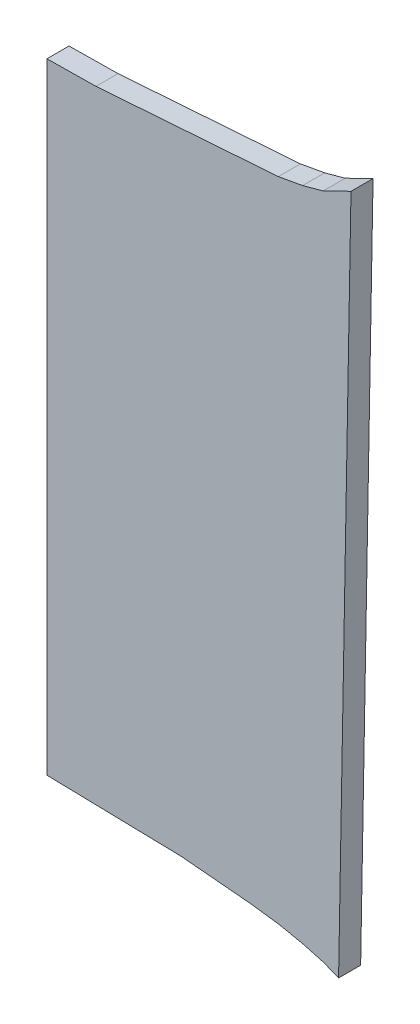
ISO-10303-21;
HEADER;
FILE_DESCRIPTION(('STEP AP214'),'2;1');
FILE_NAME('part.step','',(''),(''),'','','');
FILE_SCHEMA(('AUTOMOTIVE_DESIGN { 1 0 10303 214 1 1 1 1 }'));
ENDSEC;
DATA;
#1=APPLICATION_CONTEXT('core data for automotive mechanical design processes');
#2=APPLICATION_PROTOCOL_DEFINITION('international standard','automotive_design',2000,#1);
#3=PRODUCT_CONTEXT('',#1,'mechanical');
#4=PRODUCT('Part','Part','',(#3));
#5=PRODUCT_RELATED_PRODUCT_CATEGORY('part','',(#4));
#6=PRODUCT_DEFINITION_FORMATION('','',#4);
#7=PRODUCT_DEFINITION_CONTEXT('part definition',#1,'design');
#8=PRODUCT_DEFINITION('design','',#6,#7);
#9=PRODUCT_DEFINITION_SHAPE('','',#8);
#10=(LENGTH_UNIT() NAMED_UNIT(*) SI_UNIT(.MILLI.,.METRE.));
#11=(NAMED_UNIT(*) PLANE_ANGLE_UNIT() SI_UNIT($,.RADIAN.));
#12=(NAMED_UNIT(*) SI_UNIT($,.STERADIAN.) SOLID_ANGLE_UNIT());
#13=UNCERTAINTY_MEASURE_WITH_UNIT(LENGTH_MEASURE(1.E-05),#10,'distance_accuracy_value','');
#14=(GEOMETRIC_REPRESENTATION_CONTEXT(3) GLOBAL_UNCERTAINTY_ASSIGNED_CONTEXT((#13)) GLOBAL_UNIT_ASSIGNED_CONTEXT((#10,
#11,#12)) REPRESENTATION_CONTEXT('',''));
#15=CARTESIAN_POINT('',(0.,0.,0.));
#16=DIRECTION('',(0.,0.,1.));
#17=DIRECTION('',(1.,0.,0.));
#18=AXIS2_PLACEMENT_3D('',#15,#16,#17);
#19=CARTESIAN_POINT('',(79.9499969482422,95.5,0.));
#20=DIRECTION('',(0.0231288775813622,0.999732491730576,0.));
#21=DIRECTION('',(0.999732491730576,-0.0231288775813622,0.));
#22=AXIS2_PLACEMENT_3D('',#19,#20,#21);
#23=PLANE('',#22);
#24=DIRECTION('',(0.999732491730576,-0.0231288775813622,0.));
#25=VECTOR('',#24,1.);
#26=CARTESIAN_POINT('',(79.9499969482422,95.5,0.03556));
#27=LINE('',#26,#25);
#28=CARTESIAN_POINT('',(79.9499969482422,95.5,0.03556));
#29=VERTEX_POINT('',#28);
#30=CARTESIAN_POINT('',(80.1660003662109,95.495002746582,0.03556));
#31=VERTEX_POINT('',#30);
#32=EDGE_CURVE('E11',#29,#31,#27,.T.);
#33=ORIENTED_EDGE('',*,*,#32,.F.);
#34=DIRECTION('',(0.,0.,1.));
#35=VECTOR('',#34,1.);
#36=CARTESIAN_POINT('',(79.9499969482422,95.5,0.));
#37=LINE('',#36,#35);
#38=CARTESIAN_POINT('',(79.9499969482422,95.5,0.));
#39=VERTEX_POINT('',#38);
#40=EDGE_CURVE('E24',#39,#29,#37,.T.);
#41=ORIENTED_EDGE('',*,*,#40,.F.);
#42=DIRECTION('',(0.999732491730576,-0.0231288775813622,0.));
#43=VECTOR('',#42,1.);
#44=CARTESIAN_POINT('',(79.9499969482422,95.5,0.));
#45=LINE('',#44,#43);
#46=CARTESIAN_POINT('',(80.1660003662109,95.495002746582,0.));
#47=VERTEX_POINT('',#46);
#48=EDGE_CURVE('E130',#39,#47,#45,.T.);
#49=ORIENTED_EDGE('',*,*,#48,.T.);
#50=DIRECTION('',(0.,0.,1.));
#51=VECTOR('',#50,1.);
#52=CARTESIAN_POINT('',(80.1660003662109,95.495002746582,0.));
#53=LINE('',#52,#51);
#54=EDGE_CURVE('E37',#47,#31,#53,.T.);
#55=ORIENTED_EDGE('',*,*,#54,.T.);
#56=EDGE_LOOP('',(#33,#41,#49,#55));
#57=FACE_BOUND('',#56,.T.);
#58=ADVANCED_FACE('F17',(#57),#23,.F.);
#59=CARTESIAN_POINT('',(80.1660003662109,95.495002746582,0.));
#60=DIRECTION('',(0.0897456692717737,0.995964715663643,0.));
#61=DIRECTION('',(0.995964715663643,-0.0897456692717737,0.));
#62=AXIS2_PLACEMENT_3D('',#59,#60,#61);
#63=PLANE('',#62);
#64=DIRECTION('',(0.995964715663643,-0.0897456692717737,0.));
#65=VECTOR('',#64,1.);
#66=CARTESIAN_POINT('',(80.1660003662109,95.495002746582,0.03556));
#67=LINE('',#66,#65);
#68=CARTESIAN_POINT('',(80.2770004272461,95.4850006103516,0.03556));
#69=VERTEX_POINT('',#68);
#70=EDGE_CURVE('E210',#31,#69,#67,.T.);
#71=ORIENTED_EDGE('',*,*,#70,.F.);
#72=ORIENTED_EDGE('',*,*,#54,.F.);
#73=DIRECTION('',(0.995964715663643,-0.0897456692717737,0.));
#74=VECTOR('',#73,1.);
#75=CARTESIAN_POINT('',(80.1660003662109,95.495002746582,0.));
#76=LINE('',#75,#74);
#77=CARTESIAN_POINT('',(80.2770004272461,95.4850006103516,0.));
#78=VERTEX_POINT('',#77);
#79=EDGE_CURVE('E207',#47,#78,#76,.T.);
#80=ORIENTED_EDGE('',*,*,#79,.T.);
#81=DIRECTION('',(0.,0.,1.));
#82=VECTOR('',#81,1.);
#83=CARTESIAN_POINT('',(80.2770004272461,95.4850006103516,0.));
#84=LINE('',#83,#82);
#85=EDGE_CURVE('E205',#78,#69,#84,.T.);
#86=ORIENTED_EDGE('',*,*,#85,.T.);
#87=EDGE_LOOP('',(#71,#72,#80,#86));
#88=FACE_BOUND('',#87,.T.);
#89=ADVANCED_FACE('F218',(#88),#63,.F.);
#90=CARTESIAN_POINT('',(80.2770004272461,95.4850006103516,0.));
#91=DIRECTION('',(0.129437620660577,0.991587566661527,0.));
#92=DIRECTION('',(0.991587566661527,-0.129437620660577,0.));
#93=AXIS2_PLACEMENT_3D('',#90,#91,#92);
#94=PLANE('',#93);
#95=DIRECTION('',(0.991587566661527,-0.129437620660577,0.));
#96=VECTOR('',#95,1.);
#97=CARTESIAN_POINT('',(80.2770004272461,95.4850006103516,0.03556));
#98=LINE('',#97,#96);
#99=CARTESIAN_POINT('',(80.322998046875,95.4789962768555,0.03556));
#100=VERTEX_POINT('',#99);
#101=EDGE_CURVE('E202',#69,#100,#98,.T.);
#102=ORIENTED_EDGE('',*,*,#101,.F.);
#103=ORIENTED_EDGE('',*,*,#85,.F.);
#104=DIRECTION('',(0.991587566661527,-0.129437620660577,0.));
#105=VECTOR('',#104,1.);
#106=CARTESIAN_POINT('',(80.2770004272461,95.4850006103516,0.));
#107=LINE('',#106,#105);
#108=CARTESIAN_POINT('',(80.322998046875,95.4789962768555,0.));
#109=VERTEX_POINT('',#108);
#110=EDGE_CURVE('E199',#78,#109,#107,.T.);
#111=ORIENTED_EDGE('',*,*,#110,.T.);
#112=DIRECTION('',(0.,0.,1.));
#113=VECTOR('',#112,1.);
#114=CARTESIAN_POINT('',(80.322998046875,95.4789962768555,0.));
#115=LINE('',#114,#113);
#116=EDGE_CURVE('E197',#109,#100,#115,.T.);
#117=ORIENTED_EDGE('',*,*,#116,.T.);
#118=EDGE_LOOP('',(#102,#103,#111,#117));
#119=FACE_BOUND('',#118,.T.);
#120=ADVANCED_FACE('F224',(#119),#94,.F.);
#121=CARTESIAN_POINT('',(80.322998046875,95.4789962768555,0.));
#122=DIRECTION('',(0.200830976371698,0.979625907645153,0.));
#123=DIRECTION('',(0.979625907645153,-0.200830976371698,0.));
#124=AXIS2_PLACEMENT_3D('',#121,#122,#123);
#125=PLANE('',#124);
#126=DIRECTION('',(0.979625907645153,-0.200830976371698,0.));
#127=VECTOR('',#126,1.);
#128=CARTESIAN_POINT('',(80.322998046875,95.4789962768555,0.03556));
#129=LINE('',#128,#127);
#130=CARTESIAN_POINT('',(80.3619995117188,95.4710006713867,0.03556));
#131=VERTEX_POINT('',#130);
#132=EDGE_CURVE('E194',#100,#131,#129,.T.);
#133=ORIENTED_EDGE('',*,*,#132,.F.);
#134=ORIENTED_EDGE('',*,*,#116,.F.);
#135=DIRECTION('',(0.979625907645153,-0.200830976371698,0.));
#136=VECTOR('',#135,1.);
#137=CARTESIAN_POINT('',(80.322998046875,95.4789962768555,0.));
#138=LINE('',#137,#136);
#139=CARTESIAN_POINT('',(80.3619995117188,95.4710006713867,0.));
#140=VERTEX_POINT('',#139);
#141=EDGE_CURVE('E191',#109,#140,#138,.T.);
#142=ORIENTED_EDGE('',*,*,#141,.T.);
#143=DIRECTION('',(0.,0.,1.));
#144=VECTOR('',#143,1.);
#145=CARTESIAN_POINT('',(80.3619995117188,95.4710006713867,0.));
#146=LINE('',#145,#144);
#147=EDGE_CURVE('E189',#140,#131,#146,.T.);
#148=ORIENTED_EDGE('',*,*,#147,.T.);
#149=EDGE_LOOP('',(#133,#134,#142,#148));
#150=FACE_BOUND('',#149,.T.);
#151=ADVANCED_FACE('F226',(#150),#125,.F.);
#152=CARTESIAN_POINT('',(80.3619995117188,95.4710006713867,0.));
#153=DIRECTION('',(0.263211776421839,0.964738078834281,0.));
#154=DIRECTION('',(0.964738078834281,-0.263211776421839,0.));
#155=AXIS2_PLACEMENT_3D('',#152,#153,#154);
#156=PLANE('',#155);
#157=DIRECTION('',(0.964738078834281,-0.263211776421839,0.));
#158=VECTOR('',#157,1.);
#159=CARTESIAN_POINT('',(80.3619995117188,95.4710006713867,0.03556));
#160=LINE('',#159,#158);
#161=CARTESIAN_POINT('',(80.3949966430664,95.4619979858398,0.03556));
#162=VERTEX_POINT('',#161);
#163=EDGE_CURVE('E186',#131,#162,#160,.T.);
#164=ORIENTED_EDGE('',*,*,#163,.F.);
#165=ORIENTED_EDGE('',*,*,#147,.F.);
#166=DIRECTION('',(0.964738078834281,-0.263211776421839,0.));
#167=VECTOR('',#166,1.);
#168=CARTESIAN_POINT('',(80.3619995117188,95.4710006713867,0.));
#169=LINE('',#168,#167);
#170=CARTESIAN_POINT('',(80.3949966430664,95.4619979858398,0.));
#171=VERTEX_POINT('',#170);
#172=EDGE_CURVE('E183',#140,#171,#169,.T.);
#173=ORIENTED_EDGE('',*,*,#172,.T.);
#174=DIRECTION('',(0.,0.,1.));
#175=VECTOR('',#174,1.);
#176=CARTESIAN_POINT('',(80.3949966430664,95.4619979858398,0.));
#177=LINE('',#176,#175);
#178=EDGE_CURVE('E181',#171,#162,#177,.T.);
#179=ORIENTED_EDGE('',*,*,#178,.T.);
#180=EDGE_LOOP('',(#164,#165,#173,#179));
#181=FACE_BOUND('',#180,.T.);
#182=ADVANCED_FACE('F231',(#181),#156,.F.);
#183=CARTESIAN_POINT('',(80.3949966430664,95.4619979858398,0.));
#184=DIRECTION('',(0.371195250781088,0.928554837259257,0.));
#185=DIRECTION('',(0.928554837259257,-0.371195250781088,0.));
#186=AXIS2_PLACEMENT_3D('',#183,#184,#185);
#187=PLANE('',#186);
#188=DIRECTION('',(0.928554837259257,-0.371195250781088,0.));
#189=VECTOR('',#188,1.);
#190=CARTESIAN_POINT('',(80.3949966430664,95.4619979858398,0.03556));
#191=LINE('',#190,#189);
#192=CARTESIAN_POINT('',(80.4199981689453,95.4520034790039,0.03556));
#193=VERTEX_POINT('',#192);
#194=EDGE_CURVE('E178',#162,#193,#191,.T.);
#195=ORIENTED_EDGE('',*,*,#194,.F.);
#196=ORIENTED_EDGE('',*,*,#178,.F.);
#197=DIRECTION('',(0.928554837259257,-0.371195250781088,0.));
#198=VECTOR('',#197,1.);
#199=CARTESIAN_POINT('',(80.3949966430664,95.4619979858398,0.));
#200=LINE('',#199,#198);
#201=CARTESIAN_POINT('',(80.4199981689453,95.4520034790039,0.));
#202=VERTEX_POINT('',#201);
#203=EDGE_CURVE('E175',#171,#202,#200,.T.);
#204=ORIENTED_EDGE('',*,*,#203,.T.);
#205=DIRECTION('',(0.,0.,1.));
#206=VECTOR('',#205,1.);
#207=CARTESIAN_POINT('',(80.4199981689453,95.4520034790039,0.));
#208=LINE('',#207,#206);
#209=EDGE_CURVE('E173',#202,#193,#208,.T.);
#210=ORIENTED_EDGE('',*,*,#209,.T.);
#211=EDGE_LOOP('',(#195,#196,#204,#210));
#212=FACE_BOUND('',#211,.T.);
#213=ADVANCED_FACE('F234',(#212),#187,.F.);
#214=CARTESIAN_POINT('',(80.4199981689453,95.4520034790039,0.));
#215=DIRECTION('',(-0.999837057457282,0.0180515521538901,0.));
#216=DIRECTION('',(0.0180515521538901,0.999837057457282,0.));
#217=AXIS2_PLACEMENT_3D('',#214,#215,#216);
#218=PLANE('',#217);
#219=DIRECTION('',(0.0180515521538901,0.999837057457282,0.));
#220=VECTOR('',#219,1.);
#221=CARTESIAN_POINT('',(80.4199981689453,95.4520034790039,0.03556));
#222=LINE('',#221,#220);
#223=CARTESIAN_POINT('',(80.4400024414062,96.5599975585938,0.03556));
#224=VERTEX_POINT('',#223);
#225=EDGE_CURVE('E170',#193,#224,#222,.T.);
#226=ORIENTED_EDGE('',*,*,#225,.F.);
#227=ORIENTED_EDGE('',*,*,#209,.F.);
#228=DIRECTION('',(0.0180515521538901,0.999837057457282,0.));
#229=VECTOR('',#228,1.);
#230=CARTESIAN_POINT('',(80.4199981689453,95.4520034790039,0.));
#231=LINE('',#230,#229);
#232=CARTESIAN_POINT('',(80.4400024414062,96.5599975585938,0.));
#233=VERTEX_POINT('',#232);
#234=EDGE_CURVE('E167',#202,#233,#231,.T.);
#235=ORIENTED_EDGE('',*,*,#234,.T.);
#236=DIRECTION('',(0.,0.,1.));
#237=VECTOR('',#236,1.);
#238=CARTESIAN_POINT('',(80.4400024414062,96.5599975585938,0.));
#239=LINE('',#238,#237);
#240=EDGE_CURVE('E165',#233,#224,#239,.T.);
#241=ORIENTED_EDGE('',*,*,#240,.T.);
#242=EDGE_LOOP('',(#226,#227,#235,#241));
#243=FACE_BOUND('',#242,.T.);
#244=ADVANCED_FACE('F239',(#243),#218,.F.);
#245=CARTESIAN_POINT('',(80.4400024414062,96.5599975585938,0.));
#246=DIRECTION('',(0.439092667749392,-0.898441778374493,0.));
#247=DIRECTION('',(-0.898441778374493,-0.439092667749392,0.));
#248=AXIS2_PLACEMENT_3D('',#245,#246,#247);
#249=PLANE('',#248);
#250=DIRECTION('',(-0.898441778374493,-0.439092667749392,0.));
#251=VECTOR('',#250,1.);
#252=CARTESIAN_POINT('',(80.4400024414062,96.5599975585938,0.03556));
#253=LINE('',#252,#251);
#254=CARTESIAN_POINT('',(80.3949966430664,96.5380020141602,0.03556));
#255=VERTEX_POINT('',#254);
#256=EDGE_CURVE('E162',#224,#255,#253,.T.);
#257=ORIENTED_EDGE('',*,*,#256,.F.);
#258=ORIENTED_EDGE('',*,*,#240,.F.);
#259=DIRECTION('',(-0.898441778374493,-0.439092667749392,0.));
#260=VECTOR('',#259,1.);
#261=CARTESIAN_POINT('',(80.4400024414062,96.5599975585938,0.));
#262=LINE('',#261,#260);
#263=CARTESIAN_POINT('',(80.3949966430664,96.5380020141602,0.));
#264=VERTEX_POINT('',#263);
#265=EDGE_CURVE('E159',#233,#264,#262,.T.);
#266=ORIENTED_EDGE('',*,*,#265,.T.);
#267=DIRECTION('',(0.,0.,1.));
#268=VECTOR('',#267,1.);
#269=CARTESIAN_POINT('',(80.3949966430664,96.5380020141602,0.));
#270=LINE('',#269,#268);
#271=EDGE_CURVE('E157',#264,#255,#270,.T.);
#272=ORIENTED_EDGE('',*,*,#271,.T.);
#273=EDGE_LOOP('',(#257,#258,#266,#272));
#274=FACE_BOUND('',#273,.T.);
#275=ADVANCED_FACE('F242',(#274),#249,.F.);
#276=CARTESIAN_POINT('',(80.3949966430664,96.5380020141602,0.));
#277=DIRECTION('',(0.263211776421839,-0.964738078834281,0.));
#278=DIRECTION('',(-0.964738078834281,-0.263211776421839,0.));
#279=AXIS2_PLACEMENT_3D('',#276,#277,#278);
#280=PLANE('',#279);
#281=DIRECTION('',(-0.964738078834281,-0.263211776421839,0.));
#282=VECTOR('',#281,1.);
#283=CARTESIAN_POINT('',(80.3949966430664,96.5380020141602,0.03556));
#284=LINE('',#283,#282);
#285=CARTESIAN_POINT('',(80.3619995117188,96.5289993286133,0.03556));
#286=VERTEX_POINT('',#285);
#287=EDGE_CURVE('E154',#255,#286,#284,.T.);
#288=ORIENTED_EDGE('',*,*,#287,.F.);
#289=ORIENTED_EDGE('',*,*,#271,.F.);
#290=DIRECTION('',(-0.964738078834281,-0.263211776421839,0.));
#291=VECTOR('',#290,1.);
#292=CARTESIAN_POINT('',(80.3949966430664,96.5380020141602,0.));
#293=LINE('',#292,#291);
#294=CARTESIAN_POINT('',(80.3619995117188,96.5289993286133,0.));
#295=VERTEX_POINT('',#294);
#296=EDGE_CURVE('E151',#264,#295,#293,.T.);
#297=ORIENTED_EDGE('',*,*,#296,.T.);
#298=DIRECTION('',(0.,0.,1.));
#299=VECTOR('',#298,1.);
#300=CARTESIAN_POINT('',(80.3619995117188,96.5289993286133,0.));
#301=LINE('',#300,#299);
#302=EDGE_CURVE('E149',#295,#286,#301,.T.);
#303=ORIENTED_EDGE('',*,*,#302,.T.);
#304=EDGE_LOOP('',(#288,#289,#297,#303));
#305=FACE_BOUND('',#304,.T.);
#306=ADVANCED_FACE('F247',(#305),#280,.F.);
#307=CARTESIAN_POINT('',(80.3619995117188,96.5289993286133,0.));
#308=DIRECTION('',(0.176563619692246,-0.984289229952849,0.));
#309=DIRECTION('',(-0.984289229952849,-0.176563619692246,0.));
#310=AXIS2_PLACEMENT_3D('',#307,#308,#309);
#311=PLANE('',#310);
#312=DIRECTION('',(-0.984289229952849,-0.176563619692246,0.));
#313=VECTOR('',#312,1.);
#314=CARTESIAN_POINT('',(80.3619995117188,96.5289993286133,0.03556));
#315=LINE('',#314,#313);
#316=CARTESIAN_POINT('',(80.322998046875,96.5220031738281,0.03556));
#317=VERTEX_POINT('',#316);
#318=EDGE_CURVE('E146',#286,#317,#315,.T.);
#319=ORIENTED_EDGE('',*,*,#318,.F.);
#320=ORIENTED_EDGE('',*,*,#302,.F.);
#321=DIRECTION('',(-0.984289229952849,-0.176563619692246,0.));
#322=VECTOR('',#321,1.);
#323=CARTESIAN_POINT('',(80.3619995117188,96.5289993286133,0.));
#324=LINE('',#323,#322);
#325=CARTESIAN_POINT('',(80.322998046875,96.5220031738281,0.));
#326=VERTEX_POINT('',#325);
#327=EDGE_CURVE('E143',#295,#326,#324,.T.);
#328=ORIENTED_EDGE('',*,*,#327,.T.);
#329=DIRECTION('',(0.,0.,1.));
#330=VECTOR('',#329,1.);
#331=CARTESIAN_POINT('',(80.322998046875,96.5220031738281,0.));
#332=LINE('',#331,#330);
#333=EDGE_CURVE('E141',#326,#317,#332,.T.);
#334=ORIENTED_EDGE('',*,*,#333,.T.);
#335=EDGE_LOOP('',(#319,#320,#328,#334));
#336=FACE_BOUND('',#335,.T.);
#337=ADVANCED_FACE('F250',(#336),#311,.F.);
#338=CARTESIAN_POINT('',(80.322998046875,96.5220031738281,0.));
#339=DIRECTION('',(0.0712599265168443,-0.997457779995131,0.));
#340=DIRECTION('',(-0.997457779995131,-0.0712599265168443,0.));
#341=AXIS2_PLACEMENT_3D('',#338,#339,#340);
#342=PLANE('',#341);
#343=DIRECTION('',(-0.997457779995131,-0.0712599265168443,0.));
#344=VECTOR('',#343,1.);
#345=CARTESIAN_POINT('',(80.322998046875,96.5220031738281,0.03556));
#346=LINE('',#345,#344);
#347=CARTESIAN_POINT('',(80.0289993286133,96.5009994506836,0.03556));
#348=VERTEX_POINT('',#347);
#349=EDGE_CURVE('E138',#317,#348,#346,.T.);
#350=ORIENTED_EDGE('',*,*,#349,.F.);
#351=ORIENTED_EDGE('',*,*,#333,.F.);
#352=DIRECTION('',(-0.997457779995131,-0.0712599265168443,0.));
#353=VECTOR('',#352,1.);
#354=CARTESIAN_POINT('',(80.322998046875,96.5220031738281,0.));
#355=LINE('',#354,#353);
#356=CARTESIAN_POINT('',(80.0289993286133,96.5009994506836,0.));
#357=VERTEX_POINT('',#356);
#358=EDGE_CURVE('E136',#326,#357,#355,.T.);
#359=ORIENTED_EDGE('',*,*,#358,.T.);
#360=DIRECTION('',(0.,0.,1.));
#361=VECTOR('',#360,1.);
#362=CARTESIAN_POINT('',(80.0289993286133,96.5009994506836,0.));
#363=LINE('',#362,#361);
#364=EDGE_CURVE('E121',#357,#348,#363,.T.);
#365=ORIENTED_EDGE('',*,*,#364,.T.);
#366=EDGE_LOOP('',(#350,#351,#359,#365));
#367=FACE_BOUND('',#366,.T.);
#368=ADVANCED_FACE('F253',(#367),#342,.F.);
#369=CARTESIAN_POINT('',(80.0289993286133,96.5009994506836,0.));
#370=DIRECTION('',(0.0126498810530204,-0.999919987053636,0.));
#371=DIRECTION('',(-0.999919987053636,-0.0126498810530204,0.));
#372=AXIS2_PLACEMENT_3D('',#369,#370,#371);
#373=PLANE('',#372);
#374=DIRECTION('',(-0.999919987053636,-0.0126498810530204,0.));
#375=VECTOR('',#374,1.);
#376=CARTESIAN_POINT('',(80.0289993286133,96.5009994506836,0.03556));
#377=LINE('',#376,#375);
#378=CARTESIAN_POINT('',(79.9499969482422,96.5,0.03556));
#379=VERTEX_POINT('',#378);
#380=EDGE_CURVE('E125',#348,#379,#377,.T.);
#381=ORIENTED_EDGE('',*,*,#380,.F.);
#382=ORIENTED_EDGE('',*,*,#364,.F.);
#383=DIRECTION('',(-0.999919987053636,-0.0126498810530204,0.));
#384=VECTOR('',#383,1.);
#385=CARTESIAN_POINT('',(80.0289993286133,96.5009994506836,0.));
#386=LINE('',#385,#384);
#387=CARTESIAN_POINT('',(79.9499969482422,96.5,0.));
#388=VERTEX_POINT('',#387);
#389=EDGE_CURVE('E117',#357,#388,#386,.T.);
#390=ORIENTED_EDGE('',*,*,#389,.T.);
#391=DIRECTION('',(0.,0.,1.));
#392=VECTOR('',#391,1.);
#393=CARTESIAN_POINT('',(79.9499969482422,96.5,0.));
#394=LINE('',#393,#392);
#395=EDGE_CURVE('E107',#388,#379,#394,.T.);
#396=ORIENTED_EDGE('',*,*,#395,.T.);
#397=EDGE_LOOP('',(#381,#382,#390,#396));
#398=FACE_BOUND('',#397,.T.);
#399=ADVANCED_FACE('F120',(#398),#373,.F.);
#400=CARTESIAN_POINT('',(79.9499969482422,96.5,0.));
#401=DIRECTION('',(1.,0.,0.));
#402=DIRECTION('',(0.,-1.,0.));
#403=AXIS2_PLACEMENT_3D('',#400,#401,#402);
#404=PLANE('',#403);
#405=DIRECTION('',(0.,-1.,0.));
#406=VECTOR('',#405,1.);
#407=CARTESIAN_POINT('',(79.9499969482422,96.5,0.03556));
#408=LINE('',#407,#406);
#409=EDGE_CURVE('E113',#379,#29,#408,.T.);
#410=ORIENTED_EDGE('',*,*,#409,.F.);
#411=ORIENTED_EDGE('',*,*,#395,.F.);
#412=DIRECTION('',(0.,-1.,0.));
#413=VECTOR('',#412,1.);
#414=CARTESIAN_POINT('',(79.9499969482422,96.5,0.));
#415=LINE('',#414,#413);
#416=EDGE_CURVE('E111',#388,#39,#415,.T.);
#417=ORIENTED_EDGE('',*,*,#416,.T.);
#418=ORIENTED_EDGE('',*,*,#40,.T.);
#419=EDGE_LOOP('',(#410,#411,#417,#418));
#420=FACE_BOUND('',#419,.T.);
#421=ADVANCED_FACE('F109',(#420),#404,.F.);
#422=CARTESIAN_POINT('',(79.9499969482422,95.5,0.));
#423=DIRECTION('',(0.,0.,1.));
#424=DIRECTION('',(1.,0.,0.));
#425=AXIS2_PLACEMENT_3D('',#422,#423,#424);
#426=PLANE('',#425);
#427=ORIENTED_EDGE('',*,*,#416,.F.);
#428=ORIENTED_EDGE('',*,*,#389,.F.);
#429=ORIENTED_EDGE('',*,*,#358,.F.);
#430=ORIENTED_EDGE('',*,*,#327,.F.);
#431=ORIENTED_EDGE('',*,*,#296,.F.);
#432=ORIENTED_EDGE('',*,*,#265,.F.);
#433=ORIENTED_EDGE('',*,*,#234,.F.);
#434=ORIENTED_EDGE('',*,*,#203,.F.);
#435=ORIENTED_EDGE('',*,*,#172,.F.);
#436=ORIENTED_EDGE('',*,*,#141,.F.);
#437=ORIENTED_EDGE('',*,*,#110,.F.);
#438=ORIENTED_EDGE('',*,*,#79,.F.);
#439=ORIENTED_EDGE('',*,*,#48,.F.);
#440=EDGE_LOOP('',(#427,#428,#429,#430,#431,#432,#433,#434,#435,#436,#437,#438,#439));
#441=FACE_BOUND('',#440,.T.);
#442=ADVANCED_FACE('F128',(#441),#426,.F.);
#443=CARTESIAN_POINT('',(79.9499969482422,95.5,0.03556));
#444=DIRECTION('',(0.,0.,1.));
#445=DIRECTION('',(1.,0.,0.));
#446=AXIS2_PLACEMENT_3D('',#443,#444,#445);
#447=PLANE('',#446);
#448=ORIENTED_EDGE('',*,*,#32,.T.);
#449=ORIENTED_EDGE('',*,*,#70,.T.);
#450=ORIENTED_EDGE('',*,*,#101,.T.);
#451=ORIENTED_EDGE('',*,*,#132,.T.);
#452=ORIENTED_EDGE('',*,*,#163,.T.);
#453=ORIENTED_EDGE('',*,*,#194,.T.);
#454=ORIENTED_EDGE('',*,*,#225,.T.);
#455=ORIENTED_EDGE('',*,*,#256,.T.);
#456=ORIENTED_EDGE('',*,*,#287,.T.);
#457=ORIENTED_EDGE('',*,*,#318,.T.);
#458=ORIENTED_EDGE('',*,*,#349,.T.);
#459=ORIENTED_EDGE('',*,*,#380,.T.);
#460=ORIENTED_EDGE('',*,*,#409,.T.);
#461=EDGE_LOOP('',(#448,#449,#450,#451,#452,#453,#454,#455,#456,#457,#458,#459,#460));
#462=FACE_BOUND('',#461,.T.);
#463=ADVANCED_FACE('F221',(#462),#447,.T.);
#464=CLOSED_SHELL('',(#58,#89,#120,#151,#182,#213,#244,#275,#306,#337,#368,#399,#421,#442,#463));
#465=MANIFOLD_SOLID_BREP('B1',#464);
#466=ADVANCED_BREP_SHAPE_REPRESENTATION('',(#18,#465),#14);
#467=SHAPE_DEFINITION_REPRESENTATION(#9,#466);
ENDSEC;
END-ISO-10303-21;
